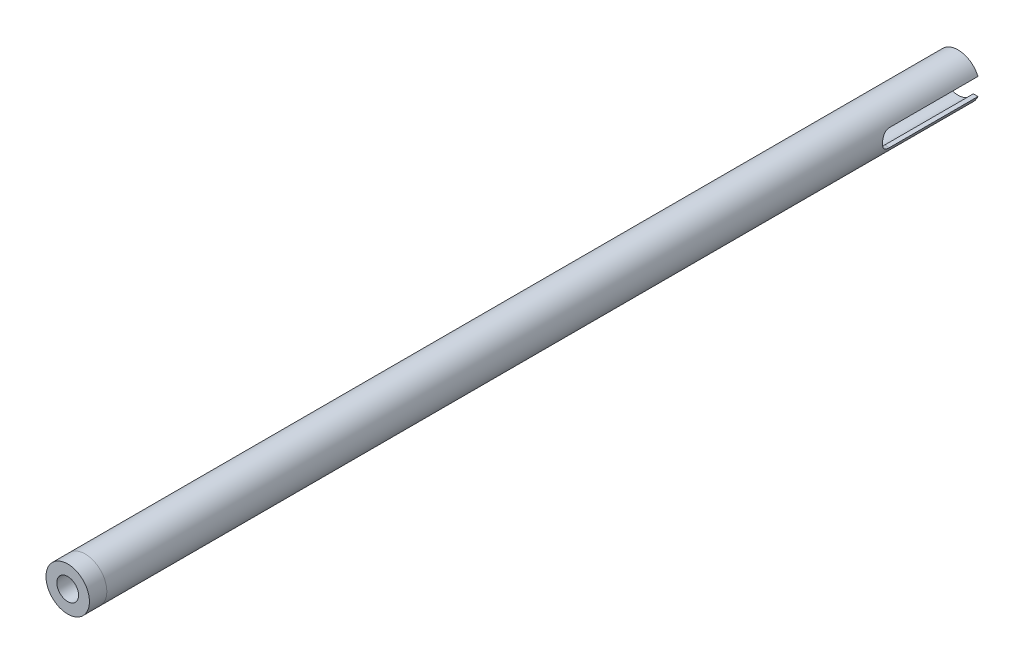
ISO-10303-21;
HEADER;
FILE_DESCRIPTION(('STEP AP214'),'2;1');
FILE_NAME('part.step','',(''),(''),'','','');
FILE_SCHEMA(('AUTOMOTIVE_DESIGN { 1 0 10303 214 1 1 1 1 }'));
ENDSEC;
DATA;
#1=APPLICATION_CONTEXT('core data for automotive mechanical design processes');
#2=APPLICATION_PROTOCOL_DEFINITION('international standard','automotive_design',2000,#1);
#3=PRODUCT_CONTEXT('',#1,'mechanical');
#4=PRODUCT('Part','Part','',(#3));
#5=PRODUCT_RELATED_PRODUCT_CATEGORY('part','',(#4));
#6=PRODUCT_DEFINITION_FORMATION('','',#4);
#7=PRODUCT_DEFINITION_CONTEXT('part definition',#1,'design');
#8=PRODUCT_DEFINITION('design','',#6,#7);
#9=PRODUCT_DEFINITION_SHAPE('','',#8);
#10=(LENGTH_UNIT() NAMED_UNIT(*) SI_UNIT(.MILLI.,.METRE.));
#11=(NAMED_UNIT(*) PLANE_ANGLE_UNIT() SI_UNIT($,.RADIAN.));
#12=(NAMED_UNIT(*) SI_UNIT($,.STERADIAN.) SOLID_ANGLE_UNIT());
#13=UNCERTAINTY_MEASURE_WITH_UNIT(LENGTH_MEASURE(1.E-05),#10,'distance_accuracy_value','');
#14=(GEOMETRIC_REPRESENTATION_CONTEXT(3) GLOBAL_UNCERTAINTY_ASSIGNED_CONTEXT((#13)) GLOBAL_UNIT_ASSIGNED_CONTEXT((#10,
#11,#12)) REPRESENTATION_CONTEXT('',''));
#15=CARTESIAN_POINT('',(0.,0.,0.));
#16=DIRECTION('',(0.,0.,1.));
#17=DIRECTION('',(1.,0.,0.));
#18=AXIS2_PLACEMENT_3D('',#15,#16,#17);
#19=CARTESIAN_POINT('',(0.,0.,-325.114013661691));
#20=DIRECTION('',(0.,0.,1.));
#21=DIRECTION('',(1.,0.,0.));
#22=AXIS2_PLACEMENT_3D('',#19,#20,#21);
#23=CYLINDRICAL_SURFACE('',#22,7.9375);
#24=CARTESIAN_POINT('',(0.,0.,-6.35));
#25=DIRECTION('',(0.,0.,1.));
#26=DIRECTION('',(1.,0.,0.));
#27=AXIS2_PLACEMENT_3D('',#24,#25,#26);
#28=CIRCLE('',#27,7.9375);
#29=CARTESIAN_POINT('',(7.9375,0.,-6.35));
#30=VERTEX_POINT('',#29);
#31=EDGE_CURVE('E165',#30,#30,#28,.T.);
#32=ORIENTED_EDGE('',*,*,#31,.F.);
#33=EDGE_LOOP('',(#32));
#34=FACE_BOUND('',#33,.T.);
#35=CARTESIAN_POINT('',(-7.2748389157424,3.175,-292.729013661691));
#36=CARTESIAN_POINT('',(-7.27482137043434,3.17501267173453,-292.643593546209));
#37=CARTESIAN_POINT('',(-7.27634297592672,3.17155313247793,-292.558183016646));
#38=CARTESIAN_POINT('',(-7.28233338484875,3.15778866907725,-292.388051012318));
#39=CARTESIAN_POINT('',(-7.28680106535325,3.14748635311323,-292.303329287459));
#40=CARTESIAN_POINT('',(-7.2985291631267,3.12019002880163,-292.13551558765));
#41=CARTESIAN_POINT('',(-7.30577831906487,3.10322299732752,-292.052418442891));
#42=CARTESIAN_POINT('',(-7.32282161153744,3.06278779397035,-291.888107340866));
#43=CARTESIAN_POINT('',(-7.33261590324725,3.03931922568674,-291.806893498752));
#44=CARTESIAN_POINT('',(-7.36535331460444,2.95952924342962,-291.56706867617));
#45=CARTESIAN_POINT('',(-7.39167595677839,2.89376893609239,-291.411943747366));
#46=CARTESIAN_POINT('',(-7.45033259991547,2.73920602658923,-291.114856320655));
#47=CARTESIAN_POINT('',(-7.48267254395243,2.65038060922872,-290.972907045437));
#48=CARTESIAN_POINT('',(-7.55175295441386,2.44684429809695,-290.698186275917));
#49=CARTESIAN_POINT('',(-7.58863404630154,2.33103943595689,-290.566258891405));
#50=CARTESIAN_POINT('',(-7.66147718953598,2.07914562663536,-290.323096007773));
#51=CARTESIAN_POINT('',(-7.69743902899202,1.94305205135848,-290.211865242846));
#52=CARTESIAN_POINT('',(-7.76611692840651,1.64778282664419,-290.00894404335));
#53=CARTESIAN_POINT('',(-7.79864638434712,1.48790317306356,-289.918209631946));
#54=CARTESIAN_POINT('',(-7.85502980346525,1.15369615984563,-289.765352078529));
#55=CARTESIAN_POINT('',(-7.87889360585224,0.979385463602722,-289.703196465911));
#56=CARTESIAN_POINT('',(-7.91022225039827,0.670405323433354,-289.622684822256));
#57=CARTESIAN_POINT('',(-7.92038443902171,0.537888188660439,-289.597006898846));
#58=CARTESIAN_POINT('',(-7.93061686811603,0.337231082382107,-289.571251815765));
#59=CARTESIAN_POINT('',(-7.93319257341971,0.269991647180298,-289.564793718484));
#60=CARTESIAN_POINT('',(-7.93663621925193,0.135173873369596,-289.556172700732));
#61=CARTESIAN_POINT('',(-7.93750363389236,0.0675954368175869,-289.554011102914));
#62=CARTESIAN_POINT('',(-7.9375,0.,-289.554013661691));
#63=B_SPLINE_CURVE_WITH_KNOTS('',3,(#35,#36,#37,#38,#39,#40,#41,#42,#43,#44,#45,#46,#47,#48,#49,
#50,#51,#52,#53,#54,#55,#56,#57,#58,#59,#60,#61,#62),.UNSPECIFIED.,.F.,.F.,(4,2,2,2,2,2,2,2,2,2,
2,2,2,4),(0.,0.256160797396612,0.512224013007058,0.767261264672238,1.02231406945471,
1.53142416248594,2.04103978047897,2.57679273649398,3.11266809162683,3.66991136029742,
4.22651992730645,4.63134321412666,4.8339937586662,5.03670667834028),.UNSPECIFIED.);
#64=CARTESIAN_POINT('',(-7.2748389157424,3.175,-292.729013661691));
#65=VERTEX_POINT('',#64);
#66=CARTESIAN_POINT('',(-7.9375,0.,-289.554013661691));
#67=VERTEX_POINT('',#66);
#68=EDGE_CURVE('E192',#65,#67,#63,.T.);
#69=ORIENTED_EDGE('',*,*,#68,.T.);
#70=CARTESIAN_POINT('',(-7.9375,0.,-289.554013661691));
#71=CARTESIAN_POINT('',(-7.93751279435796,-0.0856973243893185,-289.554001631522));
#72=CARTESIAN_POINT('',(-7.93611246860092,-0.171386675169291,-289.557482998994));
#73=CARTESIAN_POINT('',(-7.93058107051394,-0.342092796869088,-289.571339094329));
#74=CARTESIAN_POINT('',(-7.92645080745519,-0.427109759557717,-289.581711779312));
#75=CARTESIAN_POINT('',(-7.91557399086504,-0.595570690948319,-289.60920897338));
#76=CARTESIAN_POINT('',(-7.90883664469869,-0.67901912358001,-289.626309724652));
#77=CARTESIAN_POINT('',(-7.89293284658536,-0.844038966454646,-289.667076972126));
#78=CARTESIAN_POINT('',(-7.88376629739099,-0.925610301410303,-289.690743731183));
#79=CARTESIAN_POINT('',(-7.85297007832481,-1.16656173687588,-289.771251386881));
#80=CARTESIAN_POINT('',(-7.82802544143958,-1.32244720282989,-289.837644019758));
#81=CARTESIAN_POINT('',(-7.77174407779742,-1.62081902572888,-289.993689423751));
#82=CARTESIAN_POINT('',(-7.74040257287306,-1.7632952496653,-290.083359595814));
#83=CARTESIAN_POINT('',(-7.67287736621953,-2.03755465224644,-290.28781320333));
#84=CARTESIAN_POINT('',(-7.63654472176442,-2.16862853615059,-290.403500060061));
#85=CARTESIAN_POINT('',(-7.56380976030912,-2.41011022612819,-290.65479416177));
#86=CARTESIAN_POINT('',(-7.52740741976911,-2.52050895891189,-290.790410106253));
#87=CARTESIAN_POINT('',(-7.45683282624284,-2.72240939900242,-291.085108601119));
#88=CARTESIAN_POINT('',(-7.4228346735038,-2.81283701743189,-291.244972591034));
#89=CARTESIAN_POINT('',(-7.3633362219632,-2.96511894168388,-291.579098555831));
#90=CARTESIAN_POINT('',(-7.33782422493328,-3.02701262758154,-291.75334029359));
#91=CARTESIAN_POINT('',(-7.30424985403508,-3.10695047193342,-292.061644018241));
#92=CARTESIAN_POINT('',(-7.29331360019113,-3.13238569878909,-292.193502779127));
#93=CARTESIAN_POINT('',(-7.28227977674291,-3.15790858319001,-292.393219660821));
#94=CARTESIAN_POINT('',(-7.27949685702346,-3.16431127275807,-292.460167951581));
#95=CARTESIAN_POINT('',(-7.27577355567174,-3.17285909036155,-292.594409509447));
#96=CARTESIAN_POINT('',(-7.27483380475762,-3.1750027609968,-292.661702886745));
#97=CARTESIAN_POINT('',(-7.2748389157424,-3.175,-292.729013661691));
#98=B_SPLINE_CURVE_WITH_KNOTS('',3,(#70,#71,#72,#73,#74,#75,#76,#77,#78,#79,#80,#81,#82,#83,#84,
#85,#86,#87,#88,#89,#90,#91,#92,#93,#94,#95,#96,#97),.UNSPECIFIED.,.F.,.F.,(4,2,2,2,2,2,2,2,2,2,
2,2,2,4),(0.,0.256996432008007,0.513916713336978,0.769937797705386,1.02596913282157,
1.53722547809954,2.04886511530059,2.58219314099272,3.11575467201799,3.67332953074261,
4.2301325519037,4.63306130520181,4.83485003827446,5.03670780985612),.UNSPECIFIED.);
#99=CARTESIAN_POINT('',(-7.2748389157424,-3.175,-292.729013661691));
#100=VERTEX_POINT('',#99);
#101=EDGE_CURVE('E144',#67,#100,#98,.T.);
#102=ORIENTED_EDGE('',*,*,#101,.T.);
#103=DIRECTION('',(0.,0.,-1.));
#104=VECTOR('',#103,1.);
#105=CARTESIAN_POINT('',(-7.2748389157424,-3.175,-289.554013661691));
#106=LINE('',#105,#104);
#107=CARTESIAN_POINT('',(-7.2748389157424,-3.175,-325.114013661691));
#108=VERTEX_POINT('',#107);
#109=EDGE_CURVE('E139',#100,#108,#106,.T.);
#110=ORIENTED_EDGE('',*,*,#109,.T.);
#111=CARTESIAN_POINT('',(0.,0.,-325.114013661691));
#112=DIRECTION('',(0.,0.,1.));
#113=DIRECTION('',(1.,0.,0.));
#114=AXIS2_PLACEMENT_3D('',#111,#112,#113);
#115=CIRCLE('',#114,7.9375);
#116=CARTESIAN_POINT('',(7.2748389157424,-3.175,-325.114013661691));
#117=VERTEX_POINT('',#116);
#118=EDGE_CURVE('E142',#108,#117,#115,.T.);
#119=ORIENTED_EDGE('',*,*,#118,.T.);
#120=DIRECTION('',(0.,0.,-1.));
#121=VECTOR('',#120,1.);
#122=CARTESIAN_POINT('',(7.2748389157424,-3.175,-289.554013661691));
#123=LINE('',#122,#121);
#124=CARTESIAN_POINT('',(7.2748389157424,-3.175,-292.729013661691));
#125=VERTEX_POINT('',#124);
#126=EDGE_CURVE('E425',#125,#117,#123,.T.);
#127=ORIENTED_EDGE('',*,*,#126,.F.);
#128=CARTESIAN_POINT('',(7.2748389157424,-3.175,-292.729013661691));
#129=CARTESIAN_POINT('',(7.27482137043434,-3.17501267173453,-292.643593546209));
#130=CARTESIAN_POINT('',(7.27634297592672,-3.17155313247793,-292.558183016646));
#131=CARTESIAN_POINT('',(7.28233338484875,-3.15778866907725,-292.388051012318));
#132=CARTESIAN_POINT('',(7.28680106535325,-3.14748635311323,-292.303329287459));
#133=CARTESIAN_POINT('',(7.2985291631267,-3.12019002880163,-292.13551558765));
#134=CARTESIAN_POINT('',(7.30577831906487,-3.10322299732752,-292.052418442891));
#135=CARTESIAN_POINT('',(7.32282161153744,-3.06278779397035,-291.888107340866));
#136=CARTESIAN_POINT('',(7.33261590324725,-3.03931922568674,-291.806893498752));
#137=CARTESIAN_POINT('',(7.36535331460444,-2.95952924342962,-291.56706867617));
#138=CARTESIAN_POINT('',(7.39167595677839,-2.89376893609239,-291.411943747366));
#139=CARTESIAN_POINT('',(7.45033259991547,-2.73920602658923,-291.114856320655));
#140=CARTESIAN_POINT('',(7.48267254395243,-2.65038060922872,-290.972907045437));
#141=CARTESIAN_POINT('',(7.55175295441386,-2.44684429809695,-290.698186275917));
#142=CARTESIAN_POINT('',(7.58863404630154,-2.33103943595689,-290.566258891405));
#143=CARTESIAN_POINT('',(7.66147718953598,-2.07914562663536,-290.323096007773));
#144=CARTESIAN_POINT('',(7.69743902899202,-1.94305205135848,-290.211865242846));
#145=CARTESIAN_POINT('',(7.76611692840651,-1.64778282664419,-290.00894404335));
#146=CARTESIAN_POINT('',(7.79864638434712,-1.48790317306356,-289.918209631946));
#147=CARTESIAN_POINT('',(7.85502980346525,-1.15369615984563,-289.765352078529));
#148=CARTESIAN_POINT('',(7.87889360585224,-0.979385463602722,-289.703196465911));
#149=CARTESIAN_POINT('',(7.91022225039827,-0.670405323433354,-289.622684822256));
#150=CARTESIAN_POINT('',(7.92038443902171,-0.537888188660439,-289.597006898846));
#151=CARTESIAN_POINT('',(7.93061686811603,-0.337231082382107,-289.571251815765));
#152=CARTESIAN_POINT('',(7.93319257341971,-0.269991647180298,-289.564793718484));
#153=CARTESIAN_POINT('',(7.93663621925193,-0.135173873369596,-289.556172700732));
#154=CARTESIAN_POINT('',(7.93750363389236,-0.0675954368175869,-289.554011102914));
#155=CARTESIAN_POINT('',(7.9375,0.,-289.554013661691));
#156=B_SPLINE_CURVE_WITH_KNOTS('',3,(#128,#129,#130,#131,#132,#133,#134,#135,#136,#137,#138,
#139,#140,#141,#142,#143,#144,#145,#146,#147,#148,#149,#150,#151,#152,#153,#154,#155),
.UNSPECIFIED.,.F.,.F.,(4,2,2,2,2,2,2,2,2,2,2,2,2,4),(0.,0.256160797396612,0.512224013007058,
0.767261264672238,1.02231406945471,1.53142416248594,2.04103978047897,2.57679273649398,
3.11266809162683,3.66991136029742,4.22651992730645,4.63134321412666,4.8339937586662,
5.03670667834028),.UNSPECIFIED.);
#157=CARTESIAN_POINT('',(7.9375,0.,-289.554013661691));
#158=VERTEX_POINT('',#157);
#159=EDGE_CURVE('E85',#125,#158,#156,.T.);
#160=ORIENTED_EDGE('',*,*,#159,.T.);
#161=CARTESIAN_POINT('',(7.9375,0.,-289.554013661691));
#162=CARTESIAN_POINT('',(7.93751279435796,0.0856973243893185,-289.554001631522));
#163=CARTESIAN_POINT('',(7.93611246860092,0.171386675169291,-289.557482998994));
#164=CARTESIAN_POINT('',(7.93058107051394,0.342092796869088,-289.571339094329));
#165=CARTESIAN_POINT('',(7.92645080745519,0.427109759557717,-289.581711779312));
#166=CARTESIAN_POINT('',(7.91557399086504,0.595570690948319,-289.60920897338));
#167=CARTESIAN_POINT('',(7.90883664469869,0.67901912358001,-289.626309724652));
#168=CARTESIAN_POINT('',(7.89293284658536,0.844038966454646,-289.667076972126));
#169=CARTESIAN_POINT('',(7.88376629739099,0.925610301410303,-289.690743731183));
#170=CARTESIAN_POINT('',(7.85297007832481,1.16656173687588,-289.771251386881));
#171=CARTESIAN_POINT('',(7.82802544143958,1.32244720282989,-289.837644019758));
#172=CARTESIAN_POINT('',(7.77174407779742,1.62081902572888,-289.993689423751));
#173=CARTESIAN_POINT('',(7.74040257287306,1.7632952496653,-290.083359595814));
#174=CARTESIAN_POINT('',(7.67287736621953,2.03755465224644,-290.28781320333));
#175=CARTESIAN_POINT('',(7.63654472176442,2.16862853615059,-290.403500060061));
#176=CARTESIAN_POINT('',(7.56380976030912,2.41011022612819,-290.65479416177));
#177=CARTESIAN_POINT('',(7.52740741976911,2.52050895891189,-290.790410106253));
#178=CARTESIAN_POINT('',(7.45683282624284,2.72240939900242,-291.085108601119));
#179=CARTESIAN_POINT('',(7.4228346735038,2.81283701743189,-291.244972591034));
#180=CARTESIAN_POINT('',(7.3633362219632,2.96511894168388,-291.579098555831));
#181=CARTESIAN_POINT('',(7.33782422493328,3.02701262758154,-291.75334029359));
#182=CARTESIAN_POINT('',(7.30424985403508,3.10695047193342,-292.061644018241));
#183=CARTESIAN_POINT('',(7.29331360019113,3.13238569878909,-292.193502779127));
#184=CARTESIAN_POINT('',(7.28227977674291,3.15790858319001,-292.393219660821));
#185=CARTESIAN_POINT('',(7.27949685702346,3.16431127275807,-292.460167951581));
#186=CARTESIAN_POINT('',(7.27577355567174,3.17285909036155,-292.594409509447));
#187=CARTESIAN_POINT('',(7.27483380475762,3.1750027609968,-292.661702886745));
#188=CARTESIAN_POINT('',(7.2748389157424,3.175,-292.729013661691));
#189=B_SPLINE_CURVE_WITH_KNOTS('',3,(#161,#162,#163,#164,#165,#166,#167,#168,#169,#170,#171,
#172,#173,#174,#175,#176,#177,#178,#179,#180,#181,#182,#183,#184,#185,#186,#187,#188),
.UNSPECIFIED.,.F.,.F.,(4,2,2,2,2,2,2,2,2,2,2,2,2,4),(0.,0.256996432008007,0.513916713336978,
0.769937797705386,1.02596913282157,1.53722547809954,2.04886511530059,2.58219314099272,
3.11575467201799,3.67332953074261,4.2301325519037,4.63306130520181,4.83485003827446,
5.03670780985612),.UNSPECIFIED.);
#190=CARTESIAN_POINT('',(7.2748389157424,3.175,-292.729013661691));
#191=VERTEX_POINT('',#190);
#192=EDGE_CURVE('E71',#158,#191,#189,.T.);
#193=ORIENTED_EDGE('',*,*,#192,.T.);
#194=DIRECTION('',(0.,0.,-1.));
#195=VECTOR('',#194,1.);
#196=CARTESIAN_POINT('',(7.2748389157424,3.175,-289.554013661691));
#197=LINE('',#196,#195);
#198=CARTESIAN_POINT('',(7.2748389157424,3.175,-325.114013661691));
#199=VERTEX_POINT('',#198);
#200=EDGE_CURVE('E158',#191,#199,#197,.T.);
#201=ORIENTED_EDGE('',*,*,#200,.T.);
#202=CARTESIAN_POINT('',(-7.2748389157424,3.175,-325.114013661691));
#203=VERTEX_POINT('',#202);
#204=EDGE_CURVE('E164',#199,#203,#115,.T.);
#205=ORIENTED_EDGE('',*,*,#204,.T.);
#206=DIRECTION('',(0.,0.,-1.));
#207=VECTOR('',#206,1.);
#208=CARTESIAN_POINT('',(-7.2748389157424,3.175,-289.554013661691));
#209=LINE('',#208,#207);
#210=EDGE_CURVE('E418',#65,#203,#209,.T.);
#211=ORIENTED_EDGE('',*,*,#210,.F.);
#212=EDGE_LOOP('',(#69,#102,#110,#119,#127,#160,#193,#201,#205,#211));
#213=FACE_BOUND('',#212,.T.);
#214=ADVANCED_FACE('F61',(#34,#213),#23,.T.);
#215=CARTESIAN_POINT('',(0.,0.,-325.114013661691));
#216=DIRECTION('',(0.,0.,1.));
#217=DIRECTION('',(1.,0.,0.));
#218=AXIS2_PLACEMENT_3D('',#215,#216,#217);
#219=PLANE('',#218);
#220=DIRECTION('',(1.,0.,0.));
#221=VECTOR('',#220,1.);
#222=CARTESIAN_POINT('',(0.,-3.175,-325.114013661691));
#223=LINE('',#222,#221);
#224=CARTESIAN_POINT('',(-5.57246419907746,-3.175,-325.114013661691));
#225=VERTEX_POINT('',#224);
#226=EDGE_CURVE('E151',#108,#225,#223,.T.);
#227=ORIENTED_EDGE('',*,*,#226,.T.);
#228=CARTESIAN_POINT('',(0.,0.,-325.114013661691));
#229=DIRECTION('',(0.,0.,1.));
#230=DIRECTION('',(1.,0.,0.));
#231=AXIS2_PLACEMENT_3D('',#228,#229,#230);
#232=CIRCLE('',#231,6.4135);
#233=CARTESIAN_POINT('',(5.57246419907746,-3.175,-325.114013661691));
#234=VERTEX_POINT('',#233);
#235=EDGE_CURVE('E273',#225,#234,#232,.T.);
#236=ORIENTED_EDGE('',*,*,#235,.T.);
#237=DIRECTION('',(1.,0.,0.));
#238=VECTOR('',#237,1.);
#239=CARTESIAN_POINT('',(0.,-3.175,-325.114013661691));
#240=LINE('',#239,#238);
#241=EDGE_CURVE('E163',#234,#117,#240,.T.);
#242=ORIENTED_EDGE('',*,*,#241,.T.);
#243=ORIENTED_EDGE('',*,*,#118,.F.);
#244=EDGE_LOOP('',(#227,#236,#242,#243));
#245=FACE_BOUND('',#244,.T.);
#246=ADVANCED_FACE('F161',(#245),#219,.F.);
#247=CARTESIAN_POINT('',(0.,0.,-325.114013661691));
#248=DIRECTION('',(0.,0.,1.));
#249=DIRECTION('',(1.,0.,0.));
#250=AXIS2_PLACEMENT_3D('',#247,#248,#249);
#251=CYLINDRICAL_SURFACE('',#250,6.4135);
#252=CARTESIAN_POINT('',(0.,0.,-6.35));
#253=DIRECTION('',(0.,0.,1.));
#254=DIRECTION('',(1.,0.,0.));
#255=AXIS2_PLACEMENT_3D('',#252,#253,#254);
#256=CIRCLE('',#255,6.4135);
#257=CARTESIAN_POINT('',(6.4135,0.,-6.35));
#258=VERTEX_POINT('',#257);
#259=EDGE_CURVE('E147',#258,#258,#256,.T.);
#260=ORIENTED_EDGE('',*,*,#259,.T.);
#261=EDGE_LOOP('',(#260));
#262=FACE_BOUND('',#261,.T.);
#263=DIRECTION('',(0.,0.,-1.));
#264=VECTOR('',#263,1.);
#265=CARTESIAN_POINT('',(-5.57246419907746,-3.175,-289.554013661691));
#266=LINE('',#265,#264);
#267=CARTESIAN_POINT('',(-5.57246419907746,-3.175,-292.729013661691));
#268=VERTEX_POINT('',#267);
#269=EDGE_CURVE('E148',#268,#225,#266,.T.);
#270=ORIENTED_EDGE('',*,*,#269,.F.);
#271=CARTESIAN_POINT('',(-5.57246419907746,-3.175,-292.729013661691));
#272=CARTESIAN_POINT('',(-5.57244013006406,-3.17501485930532,-292.645734548653));
#273=CARTESIAN_POINT('',(-5.57433046393327,-3.17172393593588,-292.562468781782));
#274=CARTESIAN_POINT('',(-5.58175879139227,-3.15864741746939,-292.39666119697));
#275=CARTESIAN_POINT('',(-5.58729459414879,-3.14886572313217,-292.314118974369));
#276=CARTESIAN_POINT('',(-5.60179156831922,-3.12299843383605,-292.15082216764));
#277=CARTESIAN_POINT('',(-5.61073298145,-3.10694918790095,-292.070060062726));
#278=CARTESIAN_POINT('',(-5.63171276239417,-3.06875665913499,-291.910416147226));
#279=CARTESIAN_POINT('',(-5.64375147558632,-3.04661269666535,-291.831534547405));
#280=CARTESIAN_POINT('',(-5.6838799338154,-2.97148657354666,-291.598801372407));
#281=CARTESIAN_POINT('',(-5.71602843451584,-2.90973243042152,-291.448380875168));
#282=CARTESIAN_POINT('',(-5.78746445334561,-2.76491119647661,-291.15992365834));
#283=CARTESIAN_POINT('',(-5.8267630725243,-2.68181088046089,-291.021906700974));
#284=CARTESIAN_POINT('',(-5.91189137020974,-2.48887418737119,-290.750109616946));
#285=CARTESIAN_POINT('',(-5.95799203211627,-2.37743022169016,-290.617552814494));
#286=CARTESIAN_POINT('',(-6.04933625068999,-2.13433179626949,-290.372085145422));
#287=CARTESIAN_POINT('',(-6.09457954365871,-2.00267122837297,-290.259180238409));
#288=CARTESIAN_POINT('',(-6.18270630442022,-1.71220053093684,-290.048860945957));
#289=CARTESIAN_POINT('',(-6.22523407848511,-1.55216870534977,-289.952971195525));
#290=CARTESIAN_POINT('',(-6.29953728626817,-1.21586879246633,-289.790122299208));
#291=CARTESIAN_POINT('',(-6.33132906884324,-1.03962591706377,-289.723119121165));
#292=CARTESIAN_POINT('',(-6.37455801221378,-0.719418942476253,-289.633247288835));
#293=CARTESIAN_POINT('',(-6.38903678436651,-0.577736145507962,-289.60367457447));
#294=CARTESIAN_POINT('',(-6.40364692368403,-0.36261698315204,-289.573953500156));
#295=CARTESIAN_POINT('',(-6.40733246196224,-0.29037059149408,-289.566485987518));
#296=CARTESIAN_POINT('',(-6.41226237468065,-0.145424356491905,-289.55651309858));
#297=CARTESIAN_POINT('',(-6.41350576158006,-0.0727243416303709,-289.554009729643));
#298=CARTESIAN_POINT('',(-6.4135,0.,-289.554013661691));
#299=B_SPLINE_CURVE_WITH_KNOTS('',3,(#271,#272,#273,#274,#275,#276,#277,#278,#279,#280,#281,
#282,#283,#284,#285,#286,#287,#288,#289,#290,#291,#292,#293,#294,#295,#296,#297,#298),
.UNSPECIFIED.,.F.,.F.,(4,2,2,2,2,2,2,2,2,2,2,2,2,4),(0.,0.249729002226608,0.499308060527582,
0.747460667546715,0.995640957972498,1.49055300136654,1.98624009021394,2.52160227908797,
3.05712653941521,3.62817923327589,4.19835836008502,4.63305000595098,4.85103401853339,
5.06910615989469),.UNSPECIFIED.);
#300=CARTESIAN_POINT('',(-6.4135,0.,-289.554013661691));
#301=VERTEX_POINT('',#300);
#302=EDGE_CURVE('E219',#268,#301,#299,.T.);
#303=ORIENTED_EDGE('',*,*,#302,.T.);
#304=CARTESIAN_POINT('',(-6.4135,0.,-289.554013661691));
#305=CARTESIAN_POINT('',(-6.41351478956105,0.0839162873638195,-289.554000261795));
#306=CARTESIAN_POINT('',(-6.41185341043851,0.167823114288182,-289.557340187842));
#307=CARTESIAN_POINT('',(-6.40528923860734,0.33495253632637,-289.570622628447));
#308=CARTESIAN_POINT('',(-6.40038773102953,0.418175389480093,-289.580562525268));
#309=CARTESIAN_POINT('',(-6.38748331817869,0.58296549878522,-289.606881329786));
#310=CARTESIAN_POINT('',(-6.37949454331383,0.664538541389253,-289.623230905274));
#311=CARTESIAN_POINT('',(-6.36062930478242,0.825821595252368,-289.662169208867));
#312=CARTESIAN_POINT('',(-6.34975266552956,0.905531492908811,-289.684758316349));
#313=CARTESIAN_POINT('',(-6.31319792977548,1.14087800407252,-289.761494879108));
#314=CARTESIAN_POINT('',(-6.28356695572383,1.29306927815055,-289.824666527296));
#315=CARTESIAN_POINT('',(-6.21648032622801,1.58455945770353,-289.972817269276));
#316=CARTESIAN_POINT('',(-6.17901685649499,1.72384528592309,-290.057818161056));
#317=CARTESIAN_POINT('',(-6.09713913910647,1.99475482128856,-290.252918299307));
#318=CARTESIAN_POINT('',(-6.05244508581476,2.12544046453043,-290.364203176045));
#319=CARTESIAN_POINT('',(-5.96206469267669,2.36716277188881,-290.60617262221));
#320=CARTESIAN_POINT('',(-5.9163776032387,2.47818397002904,-290.73687231405));
#321=CARTESIAN_POINT('',(-5.82517699615972,2.68591268931947,-291.025918143002));
#322=CARTESIAN_POINT('',(-5.77994318763785,2.78087960507694,-291.185613337582));
#323=CARTESIAN_POINT('',(-5.69959190124919,2.9420744279085,-291.520996614764));
#324=CARTESIAN_POINT('',(-5.66445328320705,3.00836254036259,-291.696650247936));
#325=CARTESIAN_POINT('',(-5.61637168534323,3.09697219420915,-292.015101622329));
#326=CARTESIAN_POINT('',(-5.60011055849822,3.1260622343607,-292.155516224989));
#327=CARTESIAN_POINT('',(-5.58363385282995,3.15533369889112,-292.368893103232));
#328=CARTESIAN_POINT('',(-5.57946041232981,3.16269716900745,-292.440624828113));
#329=CARTESIAN_POINT('',(-5.57386984218861,3.17253394278506,-292.584566768156));
#330=CARTESIAN_POINT('',(-5.57245416126573,3.17500467618403,-292.656777214827));
#331=CARTESIAN_POINT('',(-5.57246419907746,3.175,-292.729013661691));
#332=B_SPLINE_CURVE_WITH_KNOTS('',3,(#304,#305,#306,#307,#308,#309,#310,#311,#312,#313,#314,
#315,#316,#317,#318,#319,#320,#321,#322,#323,#324,#325,#326,#327,#328,#329,#330,#331),
.UNSPECIFIED.,.F.,.F.,(4,2,2,2,2,2,2,2,2,2,2,2,2,4),(0.,0.251650249697328,0.503200747298848,
0.75361328099314,1.00404104361821,1.50387930503274,2.00421864304453,2.53410176460237,
3.06439980342596,3.63519589642624,4.20478783377489,4.63602373673194,4.85251353275904,
5.06911702550462),.UNSPECIFIED.);
#333=CARTESIAN_POINT('',(-5.57246419907746,3.175,-292.729013661691));
#334=VERTEX_POINT('',#333);
#335=EDGE_CURVE('E184',#301,#334,#332,.T.);
#336=ORIENTED_EDGE('',*,*,#335,.T.);
#337=DIRECTION('',(0.,0.,-1.));
#338=VECTOR('',#337,1.);
#339=CARTESIAN_POINT('',(-5.57246419907746,3.175,-289.554013661691));
#340=LINE('',#339,#338);
#341=CARTESIAN_POINT('',(-5.57246419907746,3.175,-325.114013661691));
#342=VERTEX_POINT('',#341);
#343=EDGE_CURVE('E415',#334,#342,#340,.T.);
#344=ORIENTED_EDGE('',*,*,#343,.T.);
#345=CARTESIAN_POINT('',(5.57246419907746,3.175,-325.114013661691));
#346=VERTEX_POINT('',#345);
#347=EDGE_CURVE('E170',#346,#342,#232,.T.);
#348=ORIENTED_EDGE('',*,*,#347,.F.);
#349=DIRECTION('',(0.,0.,-1.));
#350=VECTOR('',#349,1.);
#351=CARTESIAN_POINT('',(5.57246419907746,3.175,-289.554013661691));
#352=LINE('',#351,#350);
#353=CARTESIAN_POINT('',(5.57246419907746,3.175,-292.729013661691));
#354=VERTEX_POINT('',#353);
#355=EDGE_CURVE('E267',#354,#346,#352,.T.);
#356=ORIENTED_EDGE('',*,*,#355,.F.);
#357=CARTESIAN_POINT('',(5.57246419907746,3.175,-292.729013661691));
#358=CARTESIAN_POINT('',(5.57244013006406,3.17501485930532,-292.645734548653));
#359=CARTESIAN_POINT('',(5.57433046393327,3.17172393593588,-292.562468781782));
#360=CARTESIAN_POINT('',(5.58175879139227,3.15864741746939,-292.39666119697));
#361=CARTESIAN_POINT('',(5.58729459414879,3.14886572313217,-292.314118974369));
#362=CARTESIAN_POINT('',(5.60179156831922,3.12299843383605,-292.15082216764));
#363=CARTESIAN_POINT('',(5.61073298145,3.10694918790095,-292.070060062726));
#364=CARTESIAN_POINT('',(5.63171276239417,3.06875665913499,-291.910416147226));
#365=CARTESIAN_POINT('',(5.64375147558632,3.04661269666535,-291.831534547405));
#366=CARTESIAN_POINT('',(5.6838799338154,2.97148657354666,-291.598801372407));
#367=CARTESIAN_POINT('',(5.71602843451584,2.90973243042152,-291.448380875168));
#368=CARTESIAN_POINT('',(5.78746445334561,2.76491119647661,-291.15992365834));
#369=CARTESIAN_POINT('',(5.8267630725243,2.68181088046089,-291.021906700974));
#370=CARTESIAN_POINT('',(5.91189137020974,2.48887418737119,-290.750109616946));
#371=CARTESIAN_POINT('',(5.95799203211627,2.37743022169016,-290.617552814494));
#372=CARTESIAN_POINT('',(6.04933625068999,2.13433179626949,-290.372085145422));
#373=CARTESIAN_POINT('',(6.09457954365871,2.00267122837297,-290.259180238409));
#374=CARTESIAN_POINT('',(6.18270630442022,1.71220053093684,-290.048860945957));
#375=CARTESIAN_POINT('',(6.22523407848511,1.55216870534977,-289.952971195525));
#376=CARTESIAN_POINT('',(6.29953728626817,1.21586879246633,-289.790122299208));
#377=CARTESIAN_POINT('',(6.33132906884324,1.03962591706377,-289.723119121165));
#378=CARTESIAN_POINT('',(6.37455801221378,0.719418942476253,-289.633247288835));
#379=CARTESIAN_POINT('',(6.38903678436651,0.577736145507962,-289.60367457447));
#380=CARTESIAN_POINT('',(6.40364692368403,0.36261698315204,-289.573953500156));
#381=CARTESIAN_POINT('',(6.40733246196224,0.29037059149408,-289.566485987518));
#382=CARTESIAN_POINT('',(6.41226237468065,0.145424356491905,-289.55651309858));
#383=CARTESIAN_POINT('',(6.41350576158006,0.0727243416303709,-289.554009729643));
#384=CARTESIAN_POINT('',(6.4135,0.,-289.554013661691));
#385=B_SPLINE_CURVE_WITH_KNOTS('',3,(#357,#358,#359,#360,#361,#362,#363,#364,#365,#366,#367,
#368,#369,#370,#371,#372,#373,#374,#375,#376,#377,#378,#379,#380,#381,#382,#383,#384),
.UNSPECIFIED.,.F.,.F.,(4,2,2,2,2,2,2,2,2,2,2,2,2,4),(0.,0.249729002226608,0.499308060527582,
0.747460667546715,0.995640957972498,1.49055300136654,1.98624009021394,2.52160227908797,
3.05712653941521,3.62817923327589,4.19835836008502,4.63305000595098,4.85103401853339,
5.06910615989469),.UNSPECIFIED.);
#386=CARTESIAN_POINT('',(6.4135,0.,-289.554013661691));
#387=VERTEX_POINT('',#386);
#388=EDGE_CURVE('E13',#354,#387,#385,.T.);
#389=ORIENTED_EDGE('',*,*,#388,.T.);
#390=CARTESIAN_POINT('',(6.4135,0.,-289.554013661691));
#391=CARTESIAN_POINT('',(6.41351478956105,-0.0839162873638195,-289.554000261795));
#392=CARTESIAN_POINT('',(6.41185341043851,-0.167823114288182,-289.557340187842));
#393=CARTESIAN_POINT('',(6.40528923860734,-0.33495253632637,-289.570622628447));
#394=CARTESIAN_POINT('',(6.40038773102953,-0.418175389480093,-289.580562525268));
#395=CARTESIAN_POINT('',(6.38748331817869,-0.58296549878522,-289.606881329786));
#396=CARTESIAN_POINT('',(6.37949454331383,-0.664538541389253,-289.623230905274));
#397=CARTESIAN_POINT('',(6.36062930478242,-0.825821595252368,-289.662169208867));
#398=CARTESIAN_POINT('',(6.34975266552956,-0.905531492908811,-289.684758316349));
#399=CARTESIAN_POINT('',(6.31319792977548,-1.14087800407252,-289.761494879108));
#400=CARTESIAN_POINT('',(6.28356695572383,-1.29306927815055,-289.824666527296));
#401=CARTESIAN_POINT('',(6.21648032622801,-1.58455945770353,-289.972817269276));
#402=CARTESIAN_POINT('',(6.17901685649499,-1.72384528592309,-290.057818161056));
#403=CARTESIAN_POINT('',(6.09713913910647,-1.99475482128856,-290.252918299307));
#404=CARTESIAN_POINT('',(6.05244508581476,-2.12544046453043,-290.364203176045));
#405=CARTESIAN_POINT('',(5.96206469267669,-2.36716277188881,-290.60617262221));
#406=CARTESIAN_POINT('',(5.9163776032387,-2.47818397002904,-290.73687231405));
#407=CARTESIAN_POINT('',(5.82517699615972,-2.68591268931947,-291.025918143002));
#408=CARTESIAN_POINT('',(5.77994318763785,-2.78087960507694,-291.185613337582));
#409=CARTESIAN_POINT('',(5.69959190124919,-2.9420744279085,-291.520996614764));
#410=CARTESIAN_POINT('',(5.66445328320705,-3.00836254036259,-291.696650247936));
#411=CARTESIAN_POINT('',(5.61637168534323,-3.09697219420915,-292.015101622329));
#412=CARTESIAN_POINT('',(5.60011055849822,-3.1260622343607,-292.155516224989));
#413=CARTESIAN_POINT('',(5.58363385282995,-3.15533369889112,-292.368893103232));
#414=CARTESIAN_POINT('',(5.57946041232981,-3.16269716900745,-292.440624828113));
#415=CARTESIAN_POINT('',(5.57386984218861,-3.17253394278506,-292.584566768156));
#416=CARTESIAN_POINT('',(5.57245416126573,-3.17500467618403,-292.656777214827));
#417=CARTESIAN_POINT('',(5.57246419907746,-3.175,-292.729013661691));
#418=B_SPLINE_CURVE_WITH_KNOTS('',3,(#390,#391,#392,#393,#394,#395,#396,#397,#398,#399,#400,
#401,#402,#403,#404,#405,#406,#407,#408,#409,#410,#411,#412,#413,#414,#415,#416,#417),
.UNSPECIFIED.,.F.,.F.,(4,2,2,2,2,2,2,2,2,2,2,2,2,4),(0.,0.251650249697328,0.503200747298848,
0.75361328099314,1.00404104361821,1.50387930503274,2.00421864304453,2.53410176460237,
3.06439980342596,3.63519589642624,4.20478783377489,4.63602373673194,4.85251353275904,
5.06911702550462),.UNSPECIFIED.);
#419=CARTESIAN_POINT('',(5.57246419907746,-3.175,-292.729013661691));
#420=VERTEX_POINT('',#419);
#421=EDGE_CURVE('E235',#387,#420,#418,.T.);
#422=ORIENTED_EDGE('',*,*,#421,.T.);
#423=DIRECTION('',(0.,0.,-1.));
#424=VECTOR('',#423,1.);
#425=CARTESIAN_POINT('',(5.57246419907746,-3.175,-289.554013661691));
#426=LINE('',#425,#424);
#427=EDGE_CURVE('E269',#420,#234,#426,.T.);
#428=ORIENTED_EDGE('',*,*,#427,.T.);
#429=ORIENTED_EDGE('',*,*,#235,.F.);
#430=EDGE_LOOP('',(#270,#303,#336,#344,#348,#356,#389,#422,#428,#429));
#431=FACE_BOUND('',#430,.T.);
#432=ADVANCED_FACE('F199',(#262,#431),#251,.F.);
#433=ORIENTED_EDGE('',*,*,#347,.T.);
#434=DIRECTION('',(1.,0.,0.));
#435=VECTOR('',#434,1.);
#436=CARTESIAN_POINT('',(0.,3.175,-325.114013661691));
#437=LINE('',#436,#435);
#438=EDGE_CURVE('E157',#203,#342,#437,.T.);
#439=ORIENTED_EDGE('',*,*,#438,.F.);
#440=ORIENTED_EDGE('',*,*,#204,.F.);
#441=DIRECTION('',(1.,0.,0.));
#442=VECTOR('',#441,1.);
#443=CARTESIAN_POINT('',(0.,3.175,-325.114013661691));
#444=LINE('',#443,#442);
#445=EDGE_CURVE('E251',#346,#199,#444,.T.);
#446=ORIENTED_EDGE('',*,*,#445,.F.);
#447=EDGE_LOOP('',(#433,#439,#440,#446));
#448=FACE_BOUND('',#447,.T.);
#449=ADVANCED_FACE('F284',(#448),#219,.F.);
#450=CARTESIAN_POINT('',(0.,0.,-6.35));
#451=DIRECTION('',(0.,0.,1.));
#452=DIRECTION('',(1.,0.,0.));
#453=AXIS2_PLACEMENT_3D('',#450,#451,#452);
#454=PLANE('',#453);
#455=ORIENTED_EDGE('',*,*,#259,.F.);
#456=EDGE_LOOP('',(#455));
#457=FACE_BOUND('',#456,.T.);
#458=ORIENTED_EDGE('',*,*,#31,.T.);
#459=EDGE_LOOP('',(#458));
#460=FACE_BOUND('',#459,.T.);
#461=ADVANCED_FACE('F281',(#457,#460),#454,.T.);
#462=CARTESIAN_POINT('',(0.,3.175,-289.554013661691));
#463=DIRECTION('',(0.,1.,0.));
#464=DIRECTION('',(0.,0.,1.));
#465=AXIS2_PLACEMENT_3D('',#462,#463,#464);
#466=PLANE('',#465);
#467=ORIENTED_EDGE('',*,*,#200,.F.);
#468=DIRECTION('',(1.,0.,0.));
#469=VECTOR('',#468,1.);
#470=CARTESIAN_POINT('',(5.57246419907746,3.175,-292.729013661691));
#471=LINE('',#470,#469);
#472=EDGE_CURVE('E182',#191,#354,#471,.F.);
#473=ORIENTED_EDGE('',*,*,#472,.T.);
#474=ORIENTED_EDGE('',*,*,#355,.T.);
#475=ORIENTED_EDGE('',*,*,#445,.T.);
#476=EDGE_LOOP('',(#467,#473,#474,#475));
#477=FACE_BOUND('',#476,.T.);
#478=ADVANCED_FACE('F264',(#477),#466,.F.);
#479=CARTESIAN_POINT('',(0.,-3.175,-289.554013661691));
#480=DIRECTION('',(0.,1.,0.));
#481=DIRECTION('',(0.,0.,1.));
#482=AXIS2_PLACEMENT_3D('',#479,#480,#481);
#483=PLANE('',#482);
#484=ORIENTED_EDGE('',*,*,#427,.F.);
#485=DIRECTION('',(1.,0.,0.));
#486=VECTOR('',#485,1.);
#487=CARTESIAN_POINT('',(0.,-3.175,-292.729013661691));
#488=LINE('',#487,#486);
#489=EDGE_CURVE('E179',#420,#125,#488,.T.);
#490=ORIENTED_EDGE('',*,*,#489,.T.);
#491=ORIENTED_EDGE('',*,*,#126,.T.);
#492=ORIENTED_EDGE('',*,*,#241,.F.);
#493=EDGE_LOOP('',(#484,#490,#491,#492));
#494=FACE_BOUND('',#493,.T.);
#495=ADVANCED_FACE('F359',(#494),#483,.T.);
#496=CARTESIAN_POINT('',(0.,-3.175,-289.554013661691));
#497=DIRECTION('',(0.,1.,0.));
#498=DIRECTION('',(0.,0.,1.));
#499=AXIS2_PLACEMENT_3D('',#496,#497,#498);
#500=PLANE('',#499);
#501=ORIENTED_EDGE('',*,*,#109,.F.);
#502=DIRECTION('',(1.,0.,0.));
#503=VECTOR('',#502,1.);
#504=CARTESIAN_POINT('',(0.,-3.175,-292.729013661691));
#505=LINE('',#504,#503);
#506=EDGE_CURVE('E177',#100,#268,#505,.T.);
#507=ORIENTED_EDGE('',*,*,#506,.T.);
#508=ORIENTED_EDGE('',*,*,#269,.T.);
#509=ORIENTED_EDGE('',*,*,#226,.F.);
#510=EDGE_LOOP('',(#501,#507,#508,#509));
#511=FACE_BOUND('',#510,.T.);
#512=ADVANCED_FACE('F152',(#511),#500,.T.);
#513=CARTESIAN_POINT('',(0.,3.175,-289.554013661691));
#514=DIRECTION('',(0.,1.,0.));
#515=DIRECTION('',(0.,0.,1.));
#516=AXIS2_PLACEMENT_3D('',#513,#514,#515);
#517=PLANE('',#516);
#518=ORIENTED_EDGE('',*,*,#343,.F.);
#519=DIRECTION('',(1.,0.,0.));
#520=VECTOR('',#519,1.);
#521=CARTESIAN_POINT('',(-7.2748389157424,3.175,-292.729013661691));
#522=LINE('',#521,#520);
#523=EDGE_CURVE('E168',#334,#65,#522,.F.);
#524=ORIENTED_EDGE('',*,*,#523,.T.);
#525=ORIENTED_EDGE('',*,*,#210,.T.);
#526=ORIENTED_EDGE('',*,*,#438,.T.);
#527=EDGE_LOOP('',(#518,#524,#525,#526));
#528=FACE_BOUND('',#527,.T.);
#529=ADVANCED_FACE('F214',(#528),#517,.F.);
#530=CARTESIAN_POINT('',(0.,0.,-292.729013661691));
#531=DIRECTION('',(1.,0.,0.));
#532=DIRECTION('',(0.,0.,-1.));
#533=AXIS2_PLACEMENT_3D('',#530,#531,#532);
#534=CYLINDRICAL_SURFACE('',#533,3.175);
#535=ORIENTED_EDGE('',*,*,#506,.F.);
#536=ORIENTED_EDGE('',*,*,#101,.F.);
#537=DIRECTION('',(1.,0.,0.));
#538=VECTOR('',#537,1.);
#539=CARTESIAN_POINT('',(0.,0.,-289.554013661691));
#540=LINE('',#539,#538);
#541=EDGE_CURVE('E249',#301,#67,#540,.F.);
#542=ORIENTED_EDGE('',*,*,#541,.F.);
#543=ORIENTED_EDGE('',*,*,#302,.F.);
#544=EDGE_LOOP('',(#535,#536,#542,#543));
#545=FACE_BOUND('',#544,.T.);
#546=ADVANCED_FACE('F207',(#545),#534,.F.);
#547=CARTESIAN_POINT('',(0.,0.,-292.729013661691));
#548=DIRECTION('',(-1.,0.,0.));
#549=DIRECTION('',(0.,0.,1.));
#550=AXIS2_PLACEMENT_3D('',#547,#548,#549);
#551=CYLINDRICAL_SURFACE('',#550,3.175);
#552=ORIENTED_EDGE('',*,*,#68,.F.);
#553=ORIENTED_EDGE('',*,*,#523,.F.);
#554=ORIENTED_EDGE('',*,*,#335,.F.);
#555=ORIENTED_EDGE('',*,*,#541,.T.);
#556=EDGE_LOOP('',(#552,#553,#554,#555));
#557=FACE_BOUND('',#556,.T.);
#558=ADVANCED_FACE('F203',(#557),#551,.F.);
#559=CARTESIAN_POINT('',(0.,0.,-292.729013661691));
#560=DIRECTION('',(-1.,0.,0.));
#561=DIRECTION('',(0.,0.,1.));
#562=AXIS2_PLACEMENT_3D('',#559,#560,#561);
#563=CYLINDRICAL_SURFACE('',#562,3.175);
#564=DIRECTION('',(1.,0.,0.));
#565=VECTOR('',#564,1.);
#566=CARTESIAN_POINT('',(7.2748389157424,0.,-289.554013661691));
#567=LINE('',#566,#565);
#568=EDGE_CURVE('E66',#387,#158,#567,.T.);
#569=ORIENTED_EDGE('',*,*,#568,.F.);
#570=ORIENTED_EDGE('',*,*,#388,.F.);
#571=ORIENTED_EDGE('',*,*,#472,.F.);
#572=ORIENTED_EDGE('',*,*,#192,.F.);
#573=EDGE_LOOP('',(#569,#570,#571,#572));
#574=FACE_BOUND('',#573,.T.);
#575=ADVANCED_FACE('F63',(#574),#563,.F.);
#576=CARTESIAN_POINT('',(0.,0.,-292.729013661691));
#577=DIRECTION('',(1.,0.,0.));
#578=DIRECTION('',(0.,0.,-1.));
#579=AXIS2_PLACEMENT_3D('',#576,#577,#578);
#580=CYLINDRICAL_SURFACE('',#579,3.175);
#581=ORIENTED_EDGE('',*,*,#421,.F.);
#582=ORIENTED_EDGE('',*,*,#568,.T.);
#583=ORIENTED_EDGE('',*,*,#159,.F.);
#584=ORIENTED_EDGE('',*,*,#489,.F.);
#585=EDGE_LOOP('',(#581,#582,#583,#584));
#586=FACE_BOUND('',#585,.T.);
#587=ADVANCED_FACE('F216',(#586),#580,.F.);
#588=CLOSED_SHELL('',(#214,#246,#432,#449,#461,#478,#495,#512,#529,#546,#558,#575,#587));
#589=MANIFOLD_SOLID_BREP('B2',#588);
#590=CARTESIAN_POINT('',(0.,0.,-6.35));
#591=DIRECTION('',(0.,0.,1.));
#592=DIRECTION('',(1.,0.,0.));
#593=AXIS2_PLACEMENT_3D('',#590,#591,#592);
#594=CYLINDRICAL_SURFACE('',#593,7.9375);
#595=CARTESIAN_POINT('',(0.,0.,-6.35));
#596=DIRECTION('',(0.,0.,1.));
#597=DIRECTION('',(1.,0.,0.));
#598=AXIS2_PLACEMENT_3D('',#595,#596,#597);
#599=CIRCLE('',#598,7.9375);
#600=CARTESIAN_POINT('',(7.9375,0.,-6.35));
#601=VERTEX_POINT('',#600);
#602=EDGE_CURVE('E60',#601,#601,#599,.T.);
#603=ORIENTED_EDGE('',*,*,#602,.T.);
#604=EDGE_LOOP('',(#603));
#605=FACE_BOUND('',#604,.T.);
#606=CARTESIAN_POINT('',(0.,0.,0.));
#607=DIRECTION('',(0.,0.,1.));
#608=DIRECTION('',(1.,0.,0.));
#609=AXIS2_PLACEMENT_3D('',#606,#607,#608);
#610=CIRCLE('',#609,7.9375);
#611=CARTESIAN_POINT('',(7.9375,0.,0.));
#612=VERTEX_POINT('',#611);
#613=EDGE_CURVE('E463',#612,#612,#610,.T.);
#614=ORIENTED_EDGE('',*,*,#613,.F.);
#615=EDGE_LOOP('',(#614));
#616=FACE_BOUND('',#615,.T.);
#617=ADVANCED_FACE('F452',(#605,#616),#594,.T.);
#618=CARTESIAN_POINT('',(0.,0.,-6.35));
#619=DIRECTION('',(0.,0.,1.));
#620=DIRECTION('',(1.,0.,0.));
#621=AXIS2_PLACEMENT_3D('',#618,#619,#620);
#622=CYLINDRICAL_SURFACE('',#621,3.96875);
#623=CARTESIAN_POINT('',(0.,0.,0.));
#624=DIRECTION('',(0.,0.,1.));
#625=DIRECTION('',(1.,0.,0.));
#626=AXIS2_PLACEMENT_3D('',#623,#624,#625);
#627=CIRCLE('',#626,3.96875);
#628=CARTESIAN_POINT('',(3.96875,0.,0.));
#629=VERTEX_POINT('',#628);
#630=EDGE_CURVE('E455',#629,#629,#627,.T.);
#631=ORIENTED_EDGE('',*,*,#630,.T.);
#632=EDGE_LOOP('',(#631));
#633=FACE_BOUND('',#632,.T.);
#634=CARTESIAN_POINT('',(0.,0.,-15.875));
#635=DIRECTION('',(0.,0.,1.));
#636=DIRECTION('',(1.,0.,0.));
#637=AXIS2_PLACEMENT_3D('',#634,#635,#636);
#638=CIRCLE('',#637,3.96875);
#639=CARTESIAN_POINT('',(3.96875,0.,-15.875));
#640=VERTEX_POINT('',#639);
#641=EDGE_CURVE('E475',#640,#640,#638,.T.);
#642=ORIENTED_EDGE('',*,*,#641,.F.);
#643=EDGE_LOOP('',(#642));
#644=FACE_BOUND('',#643,.T.);
#645=ADVANCED_FACE('F483',(#633,#644),#622,.F.);
#646=CARTESIAN_POINT('',(0.,0.,-6.35));
#647=DIRECTION('',(0.,0.,1.));
#648=DIRECTION('',(1.,0.,0.));
#649=AXIS2_PLACEMENT_3D('',#646,#647,#648);
#650=PLANE('',#649);
#651=CARTESIAN_POINT('',(0.,0.,-6.35));
#652=DIRECTION('',(0.,0.,1.));
#653=DIRECTION('',(1.,0.,0.));
#654=AXIS2_PLACEMENT_3D('',#651,#652,#653);
#655=CIRCLE('',#654,6.4135);
#656=CARTESIAN_POINT('',(6.4135,0.,-6.35));
#657=VERTEX_POINT('',#656);
#658=EDGE_CURVE('E465',#657,#657,#655,.T.);
#659=ORIENTED_EDGE('',*,*,#658,.T.);
#660=EDGE_LOOP('',(#659));
#661=FACE_BOUND('',#660,.T.);
#662=ORIENTED_EDGE('',*,*,#602,.F.);
#663=EDGE_LOOP('',(#662));
#664=FACE_BOUND('',#663,.T.);
#665=ADVANCED_FACE('F485',(#661,#664),#650,.F.);
#666=CARTESIAN_POINT('',(0.,0.,0.));
#667=DIRECTION('',(0.,0.,1.));
#668=DIRECTION('',(1.,0.,0.));
#669=AXIS2_PLACEMENT_3D('',#666,#667,#668);
#670=PLANE('',#669);
#671=ORIENTED_EDGE('',*,*,#613,.T.);
#672=EDGE_LOOP('',(#671));
#673=FACE_BOUND('',#672,.T.);
#674=ORIENTED_EDGE('',*,*,#630,.F.);
#675=EDGE_LOOP('',(#674));
#676=FACE_BOUND('',#675,.T.);
#677=ADVANCED_FACE('F491',(#673,#676),#670,.T.);
#678=CARTESIAN_POINT('',(0.,0.,-15.875));
#679=DIRECTION('',(0.,0.,1.));
#680=DIRECTION('',(1.,0.,0.));
#681=AXIS2_PLACEMENT_3D('',#678,#679,#680);
#682=CYLINDRICAL_SURFACE('',#681,6.4135);
#683=CARTESIAN_POINT('',(0.,0.,-15.875));
#684=DIRECTION('',(0.,0.,1.));
#685=DIRECTION('',(1.,0.,0.));
#686=AXIS2_PLACEMENT_3D('',#683,#684,#685);
#687=CIRCLE('',#686,6.4135);
#688=CARTESIAN_POINT('',(6.4135,0.,-15.875));
#689=VERTEX_POINT('',#688);
#690=EDGE_CURVE('E468',#689,#689,#687,.T.);
#691=CARTESIAN_POINT('',(6.4135,0.,-15.875));
#692=CARTESIAN_POINT('',(6.4135,0.,-15.77578125));
#693=CARTESIAN_POINT('',(6.4135,0.,-15.6765625));
#694=CARTESIAN_POINT('',(6.4135,0.,-15.478125));
#695=CARTESIAN_POINT('',(6.4135,0.,-15.37890625));
#696=CARTESIAN_POINT('',(6.4135,0.,-15.18046875));
#697=CARTESIAN_POINT('',(6.4135,0.,-15.08125));
#698=CARTESIAN_POINT('',(6.4135,0.,-14.8828125));
#699=CARTESIAN_POINT('',(6.4135,0.,-14.78359375));
#700=CARTESIAN_POINT('',(6.4135,0.,-14.58515625));
#701=CARTESIAN_POINT('',(6.4135,0.,-14.4859375));
#702=CARTESIAN_POINT('',(6.4135,0.,-14.2875));
#703=CARTESIAN_POINT('',(6.4135,0.,-14.18828125));
#704=CARTESIAN_POINT('',(6.4135,0.,-13.98984375));
#705=CARTESIAN_POINT('',(6.4135,0.,-13.890625));
#706=CARTESIAN_POINT('',(6.4135,0.,-13.6921875));
#707=CARTESIAN_POINT('',(6.4135,0.,-13.59296875));
#708=CARTESIAN_POINT('',(6.4135,0.,-13.39453125));
#709=CARTESIAN_POINT('',(6.4135,0.,-13.2953125));
#710=CARTESIAN_POINT('',(6.4135,0.,-13.096875));
#711=CARTESIAN_POINT('',(6.4135,0.,-12.99765625));
#712=CARTESIAN_POINT('',(6.4135,0.,-12.79921875));
#713=CARTESIAN_POINT('',(6.4135,0.,-12.7));
#714=CARTESIAN_POINT('',(6.4135,0.,-12.5015625));
#715=CARTESIAN_POINT('',(6.4135,0.,-12.40234375));
#716=CARTESIAN_POINT('',(6.4135,0.,-12.20390625));
#717=CARTESIAN_POINT('',(6.4135,0.,-12.1046875));
#718=CARTESIAN_POINT('',(6.4135,0.,-11.90625));
#719=CARTESIAN_POINT('',(6.4135,0.,-11.80703125));
#720=CARTESIAN_POINT('',(6.4135,0.,-11.60859375));
#721=CARTESIAN_POINT('',(6.4135,0.,-11.509375));
#722=CARTESIAN_POINT('',(6.4135,0.,-11.3109375));
#723=CARTESIAN_POINT('',(6.4135,0.,-11.21171875));
#724=CARTESIAN_POINT('',(6.4135,0.,-11.01328125));
#725=CARTESIAN_POINT('',(6.4135,0.,-10.9140625));
#726=CARTESIAN_POINT('',(6.4135,0.,-10.715625));
#727=CARTESIAN_POINT('',(6.4135,0.,-10.61640625));
#728=CARTESIAN_POINT('',(6.4135,0.,-10.41796875));
#729=CARTESIAN_POINT('',(6.4135,0.,-10.31875));
#730=CARTESIAN_POINT('',(6.4135,0.,-10.1203125));
#731=CARTESIAN_POINT('',(6.4135,0.,-10.02109375));
#732=CARTESIAN_POINT('',(6.4135,0.,-9.82265625));
#733=CARTESIAN_POINT('',(6.4135,0.,-9.7234375));
#734=CARTESIAN_POINT('',(6.4135,0.,-9.525));
#735=CARTESIAN_POINT('',(6.4135,0.,-9.42578125));
#736=CARTESIAN_POINT('',(6.4135,0.,-9.22734375));
#737=CARTESIAN_POINT('',(6.4135,0.,-9.128125));
#738=CARTESIAN_POINT('',(6.4135,0.,-8.9296875));
#739=CARTESIAN_POINT('',(6.4135,0.,-8.83046875));
#740=CARTESIAN_POINT('',(6.4135,0.,-8.63203125));
#741=CARTESIAN_POINT('',(6.4135,0.,-8.5328125));
#742=CARTESIAN_POINT('',(6.4135,0.,-8.334375));
#743=CARTESIAN_POINT('',(6.4135,0.,-8.23515625));
#744=CARTESIAN_POINT('',(6.4135,0.,-8.03671875));
#745=CARTESIAN_POINT('',(6.4135,0.,-7.9375));
#746=CARTESIAN_POINT('',(6.4135,0.,-7.7390625));
#747=CARTESIAN_POINT('',(6.4135,0.,-7.63984375));
#748=CARTESIAN_POINT('',(6.4135,0.,-7.44140625));
#749=CARTESIAN_POINT('',(6.4135,0.,-7.3421875));
#750=CARTESIAN_POINT('',(6.4135,0.,-7.14375));
#751=CARTESIAN_POINT('',(6.4135,0.,-7.04453125));
#752=CARTESIAN_POINT('',(6.4135,0.,-6.84609375));
#753=CARTESIAN_POINT('',(6.4135,0.,-6.746875));
#754=CARTESIAN_POINT('',(6.4135,0.,-6.5484375));
#755=CARTESIAN_POINT('',(6.4135,0.,-6.44921875));
#756=CARTESIAN_POINT('',(6.4135,0.,-6.35));
#757=B_SPLINE_CURVE_WITH_KNOTS('',3,(#691,#692,#693,#694,#695,#696,#697,#698,#699,#700,#701,
#702,#703,#704,#705,#706,#707,#708,#709,#710,#711,#712,#713,#714,#715,#716,#717,#718,#719,#720,
#721,#722,#723,#724,#725,#726,#727,#728,#729,#730,#731,#732,#733,#734,#735,#736,#737,#738,#739,
#740,#741,#742,#743,#744,#745,#746,#747,#748,#749,#750,#751,#752,#753,#754,#755,#756),
.UNSPECIFIED.,.F.,.F.,(4,2,2,2,2,2,2,2,2,2,2,2,2,2,2,2,2,2,2,2,2,2,2,2,2,2,2,2,2,2,2,2,4),(0.,
0.297656250000002,0.595312500000002,0.892968750000002,1.190625,1.48828125,1.7859375,2.08359375,
2.38125,2.67890625,2.9765625,3.27421875,3.571875,3.86953125,4.1671875,4.46484375,4.7625,
5.06015625,5.3578125,5.65546875,5.953125,6.25078125,6.5484375,6.84609375,7.14375,7.44140625,
7.7390625,8.03671875,8.334375,8.63203125,8.9296875,9.22734375,9.525),.UNSPECIFIED.);
#758=EDGE_CURVE('BSEAM496',#689,#657,#757,.T.);
#759=ORIENTED_EDGE('',*,*,#690,.T.);
#760=ORIENTED_EDGE('',*,*,#658,.F.);
#761=ORIENTED_EDGE('',*,*,#758,.T.);
#762=ORIENTED_EDGE('',*,*,#758,.F.);
#763=EDGE_LOOP('',(#759,#761,#760,#762));
#764=FACE_BOUND('',#763,.T.);
#765=ADVANCED_FACE('F496',(#764),#682,.T.);
#766=CARTESIAN_POINT('',(0.,0.,-15.875));
#767=DIRECTION('',(0.,0.,1.));
#768=DIRECTION('',(1.,0.,0.));
#769=AXIS2_PLACEMENT_3D('',#766,#767,#768);
#770=PLANE('',#769);
#771=ORIENTED_EDGE('',*,*,#641,.T.);
#772=EDGE_LOOP('',(#771));
#773=FACE_BOUND('',#772,.T.);
#774=ORIENTED_EDGE('',*,*,#690,.F.);
#775=EDGE_LOOP('',(#774));
#776=FACE_BOUND('',#775,.T.);
#777=ADVANCED_FACE('F480',(#773,#776),#770,.F.);
#778=CLOSED_SHELL('',(#617,#645,#665,#677,#765,#777));
#779=MANIFOLD_SOLID_BREP('B7',#778);
#780=ADVANCED_BREP_SHAPE_REPRESENTATION('',(#18,#589,#779),#14);
#781=SHAPE_DEFINITION_REPRESENTATION(#9,#780);
ENDSEC;
END-ISO-10303-21;
